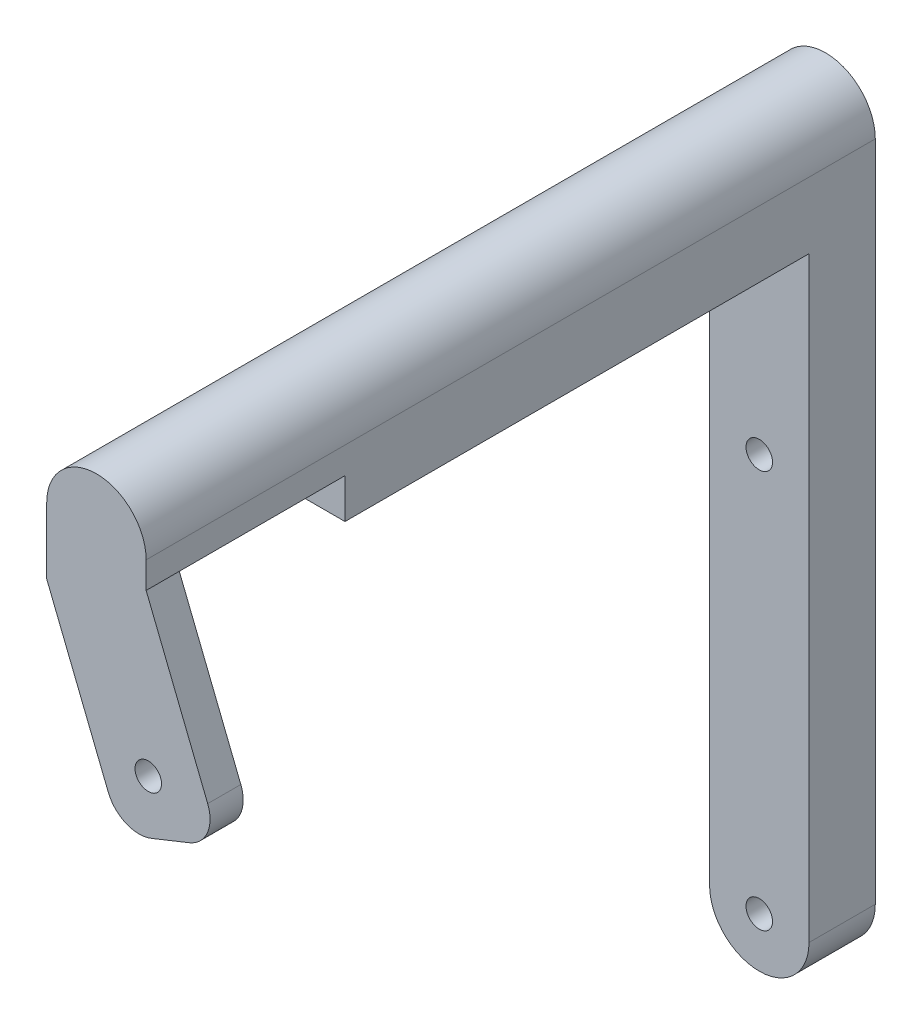
ISO-10303-21;
HEADER;
FILE_DESCRIPTION(('STEP AP214'),'2;1');
FILE_NAME('part.step','',(''),(''),'','','');
FILE_SCHEMA(('AUTOMOTIVE_DESIGN { 1 0 10303 214 1 1 1 1 }'));
ENDSEC;
DATA;
#1=APPLICATION_CONTEXT('core data for automotive mechanical design processes');
#2=APPLICATION_PROTOCOL_DEFINITION('international standard','automotive_design',2000,#1);
#3=PRODUCT_CONTEXT('',#1,'mechanical');
#4=PRODUCT('Part','Part','',(#3));
#5=PRODUCT_RELATED_PRODUCT_CATEGORY('part','',(#4));
#6=PRODUCT_DEFINITION_FORMATION('','',#4);
#7=PRODUCT_DEFINITION_CONTEXT('part definition',#1,'design');
#8=PRODUCT_DEFINITION('design','',#6,#7);
#9=PRODUCT_DEFINITION_SHAPE('','',#8);
#10=(LENGTH_UNIT() NAMED_UNIT(*) SI_UNIT(.MILLI.,.METRE.));
#11=(NAMED_UNIT(*) PLANE_ANGLE_UNIT() SI_UNIT($,.RADIAN.));
#12=(NAMED_UNIT(*) SI_UNIT($,.STERADIAN.) SOLID_ANGLE_UNIT());
#13=UNCERTAINTY_MEASURE_WITH_UNIT(LENGTH_MEASURE(1.E-05),#10,'distance_accuracy_value','');
#14=(GEOMETRIC_REPRESENTATION_CONTEXT(3) GLOBAL_UNCERTAINTY_ASSIGNED_CONTEXT((#13)) GLOBAL_UNIT_ASSIGNED_CONTEXT((#10,
#11,#12)) REPRESENTATION_CONTEXT('',''));
#15=CARTESIAN_POINT('',(0.,0.,0.));
#16=DIRECTION('',(0.,0.,1.));
#17=DIRECTION('',(1.,0.,0.));
#18=AXIS2_PLACEMENT_3D('',#15,#16,#17);
#19=CARTESIAN_POINT('',(-15.,-20.,160.));
#20=DIRECTION('',(-0.371390676354104,0.928476690885259,0.));
#21=DIRECTION('',(-0.928476690885259,-0.371390676354104,0.));
#22=AXIS2_PLACEMENT_3D('',#19,#20,#21);
#23=PLANE('',#22);
#24=DIRECTION('',(0.928476690885259,0.371390676354104,0.));
#25=VECTOR('',#24,1.);
#26=CARTESIAN_POINT('',(-15.,-20.,210.));
#27=LINE('',#26,#25);
#28=CARTESIAN_POINT('',(-15.,-20.,210.));
#29=VERTEX_POINT('',#28);
#30=CARTESIAN_POINT('',(15.,-7.99999999999999,210.));
#31=VERTEX_POINT('',#30);
#32=EDGE_CURVE('E263',#29,#31,#27,.T.);
#33=ORIENTED_EDGE('',*,*,#32,.F.);
#34=DIRECTION('',(0.,0.,-1.));
#35=VECTOR('',#34,1.);
#36=CARTESIAN_POINT('',(-15.,-20.,220.));
#37=LINE('',#36,#35);
#38=CARTESIAN_POINT('',(-15.,-20.,160.));
#39=VERTEX_POINT('',#38);
#40=EDGE_CURVE('E152',#29,#39,#37,.T.);
#41=ORIENTED_EDGE('',*,*,#40,.T.);
#42=DIRECTION('',(-0.928476690885259,-0.371390676354104,0.));
#43=VECTOR('',#42,1.);
#44=CARTESIAN_POINT('',(-15.,-20.,160.));
#45=LINE('',#44,#43);
#46=CARTESIAN_POINT('',(15.,-7.99999999999999,160.));
#47=VERTEX_POINT('',#46);
#48=EDGE_CURVE('E256',#47,#39,#45,.T.);
#49=ORIENTED_EDGE('',*,*,#48,.F.);
#50=DIRECTION('',(0.,0.,1.));
#51=VECTOR('',#50,1.);
#52=CARTESIAN_POINT('',(15.,-7.99999999999999,160.));
#53=LINE('',#52,#51);
#54=EDGE_CURVE('E170',#47,#31,#53,.T.);
#55=ORIENTED_EDGE('',*,*,#54,.T.);
#56=EDGE_LOOP('',(#33,#41,#49,#55));
#57=FACE_BOUND('',#56,.T.);
#58=ADVANCED_FACE('F41',(#57),#23,.F.);
#59=CARTESIAN_POINT('',(0.,0.,20.));
#60=DIRECTION('',(0.,0.,-1.));
#61=DIRECTION('',(-1.,0.,0.));
#62=AXIS2_PLACEMENT_3D('',#59,#60,#61);
#63=CYLINDRICAL_SURFACE('',#62,15.);
#64=CARTESIAN_POINT('',(0.,0.,0.));
#65=DIRECTION('',(0.,0.,1.));
#66=DIRECTION('',(1.,0.,0.));
#67=AXIS2_PLACEMENT_3D('',#64,#65,#66);
#68=CIRCLE('',#67,15.);
#69=CARTESIAN_POINT('',(15.,0.,0.));
#70=VERTEX_POINT('',#69);
#71=CARTESIAN_POINT('',(-15.,0.,0.));
#72=VERTEX_POINT('',#71);
#73=EDGE_CURVE('E192',#70,#72,#68,.T.);
#74=ORIENTED_EDGE('',*,*,#73,.T.);
#75=DIRECTION('',(0.,0.,-1.));
#76=VECTOR('',#75,1.);
#77=CARTESIAN_POINT('',(-15.,0.,20.));
#78=LINE('',#77,#76);
#79=CARTESIAN_POINT('',(-15.,0.,220.));
#80=VERTEX_POINT('',#79);
#81=EDGE_CURVE('E214',#80,#72,#78,.T.);
#82=ORIENTED_EDGE('',*,*,#81,.F.);
#83=CARTESIAN_POINT('',(0.,0.,220.));
#84=DIRECTION('',(0.,0.,1.));
#85=DIRECTION('',(1.,0.,0.));
#86=AXIS2_PLACEMENT_3D('',#83,#84,#85);
#87=CIRCLE('',#86,15.);
#88=CARTESIAN_POINT('',(15.,0.,220.));
#89=VERTEX_POINT('',#88);
#90=EDGE_CURVE('E159',#89,#80,#87,.T.);
#91=ORIENTED_EDGE('',*,*,#90,.F.);
#92=DIRECTION('',(0.,0.,-1.));
#93=VECTOR('',#92,1.);
#94=CARTESIAN_POINT('',(15.,0.,20.));
#95=LINE('',#94,#93);
#96=EDGE_CURVE('E189',#89,#70,#95,.T.);
#97=ORIENTED_EDGE('',*,*,#96,.T.);
#98=EDGE_LOOP('',(#74,#82,#91,#97));
#99=FACE_BOUND('',#98,.T.);
#100=ADVANCED_FACE('F296',(#99),#63,.T.);
#101=CARTESIAN_POINT('',(-15.,0.,20.));
#102=DIRECTION('',(1.,0.,0.));
#103=DIRECTION('',(0.,1.,0.));
#104=AXIS2_PLACEMENT_3D('',#101,#102,#103);
#105=PLANE('',#104);
#106=DIRECTION('',(0.,-1.,0.));
#107=VECTOR('',#106,1.);
#108=CARTESIAN_POINT('',(-15.,0.,0.));
#109=LINE('',#108,#107);
#110=CARTESIAN_POINT('',(-15.,-200.,0.));
#111=VERTEX_POINT('',#110);
#112=EDGE_CURVE('E195',#72,#111,#109,.T.);
#113=ORIENTED_EDGE('',*,*,#112,.T.);
#114=DIRECTION('',(0.,0.,-1.));
#115=VECTOR('',#114,1.);
#116=CARTESIAN_POINT('',(-15.,-200.,20.));
#117=LINE('',#116,#115);
#118=CARTESIAN_POINT('',(-15.,-200.,20.));
#119=VERTEX_POINT('',#118);
#120=EDGE_CURVE('E211',#119,#111,#117,.T.);
#121=ORIENTED_EDGE('',*,*,#120,.F.);
#122=DIRECTION('',(0.,-1.,0.));
#123=VECTOR('',#122,1.);
#124=CARTESIAN_POINT('',(-15.,0.,20.));
#125=LINE('',#124,#123);
#126=CARTESIAN_POINT('',(-15.,-20.,20.));
#127=VERTEX_POINT('',#126);
#128=EDGE_CURVE('E175',#127,#119,#125,.T.);
#129=ORIENTED_EDGE('',*,*,#128,.F.);
#130=EDGE_CURVE('E155',#39,#127,#37,.T.);
#131=ORIENTED_EDGE('',*,*,#130,.F.);
#132=ORIENTED_EDGE('',*,*,#40,.F.);
#133=CARTESIAN_POINT('',(-15.,-20.,220.));
#134=VERTEX_POINT('',#133);
#135=EDGE_CURVE('E136',#134,#29,#37,.T.);
#136=ORIENTED_EDGE('',*,*,#135,.F.);
#137=DIRECTION('',(0.,-1.,0.));
#138=VECTOR('',#137,1.);
#139=CARTESIAN_POINT('',(-15.,0.,220.));
#140=LINE('',#139,#138);
#141=EDGE_CURVE('E149',#80,#134,#140,.T.);
#142=ORIENTED_EDGE('',*,*,#141,.F.);
#143=ORIENTED_EDGE('',*,*,#81,.T.);
#144=EDGE_LOOP('',(#113,#121,#129,#131,#132,#136,#142,#143));
#145=FACE_BOUND('',#144,.T.);
#146=ADVANCED_FACE('F147',(#145),#105,.F.);
#147=CARTESIAN_POINT('',(0.,-200.,20.));
#148=DIRECTION('',(0.,0.,-1.));
#149=DIRECTION('',(-1.,0.,0.));
#150=AXIS2_PLACEMENT_3D('',#147,#148,#149);
#151=CYLINDRICAL_SURFACE('',#150,15.);
#152=CARTESIAN_POINT('',(0.,-200.,0.));
#153=DIRECTION('',(0.,0.,1.));
#154=DIRECTION('',(1.,0.,0.));
#155=AXIS2_PLACEMENT_3D('',#152,#153,#154);
#156=CIRCLE('',#155,15.);
#157=CARTESIAN_POINT('',(15.,-200.,0.));
#158=VERTEX_POINT('',#157);
#159=EDGE_CURVE('E197',#111,#158,#156,.T.);
#160=ORIENTED_EDGE('',*,*,#159,.T.);
#161=DIRECTION('',(0.,0.,-1.));
#162=VECTOR('',#161,1.);
#163=CARTESIAN_POINT('',(15.,-200.,20.));
#164=LINE('',#163,#162);
#165=CARTESIAN_POINT('',(15.,-200.,20.));
#166=VERTEX_POINT('',#165);
#167=EDGE_CURVE('E209',#166,#158,#164,.T.);
#168=ORIENTED_EDGE('',*,*,#167,.F.);
#169=CARTESIAN_POINT('',(0.,-200.,20.));
#170=DIRECTION('',(0.,0.,1.));
#171=DIRECTION('',(1.,0.,0.));
#172=AXIS2_PLACEMENT_3D('',#169,#170,#171);
#173=CIRCLE('',#172,15.);
#174=EDGE_CURVE('E177',#119,#166,#173,.T.);
#175=ORIENTED_EDGE('',*,*,#174,.F.);
#176=ORIENTED_EDGE('',*,*,#120,.T.);
#177=EDGE_LOOP('',(#160,#168,#175,#176));
#178=FACE_BOUND('',#177,.T.);
#179=ADVANCED_FACE('F335',(#178),#151,.T.);
#180=CARTESIAN_POINT('',(0.,-80.,20.));
#181=DIRECTION('',(0.,0.,-1.));
#182=DIRECTION('',(-1.,0.,0.));
#183=AXIS2_PLACEMENT_3D('',#180,#181,#182);
#184=CYLINDRICAL_SURFACE('',#183,4.);
#185=CARTESIAN_POINT('',(0.,-80.,20.));
#186=DIRECTION('',(0.,0.,1.));
#187=DIRECTION('',(1.,0.,0.));
#188=AXIS2_PLACEMENT_3D('',#185,#186,#187);
#189=CIRCLE('',#188,4.);
#190=CARTESIAN_POINT('',(3.99999999999999,-80.,20.));
#191=VERTEX_POINT('',#190);
#192=EDGE_CURVE('E183',#191,#191,#189,.T.);
#193=ORIENTED_EDGE('',*,*,#192,.T.);
#194=EDGE_LOOP('',(#193));
#195=FACE_BOUND('',#194,.T.);
#196=CARTESIAN_POINT('',(0.,-80.,0.));
#197=DIRECTION('',(0.,0.,1.));
#198=DIRECTION('',(1.,0.,0.));
#199=AXIS2_PLACEMENT_3D('',#196,#197,#198);
#200=CIRCLE('',#199,4.);
#201=CARTESIAN_POINT('',(3.99999999999999,-80.,0.));
#202=VERTEX_POINT('',#201);
#203=EDGE_CURVE('E203',#202,#202,#200,.T.);
#204=ORIENTED_EDGE('',*,*,#203,.F.);
#205=EDGE_LOOP('',(#204));
#206=FACE_BOUND('',#205,.T.);
#207=ADVANCED_FACE('F338',(#195,#206),#184,.F.);
#208=CARTESIAN_POINT('',(15.,0.,20.));
#209=DIRECTION('',(1.,0.,0.));
#210=DIRECTION('',(0.,1.,0.));
#211=AXIS2_PLACEMENT_3D('',#208,#209,#210);
#212=PLANE('',#211);
#213=ORIENTED_EDGE('',*,*,#54,.F.);
#214=DIRECTION('',(0.,1.,0.));
#215=VECTOR('',#214,1.);
#216=CARTESIAN_POINT('',(15.,-7.99999999999999,160.));
#217=LINE('',#216,#215);
#218=CARTESIAN_POINT('',(15.,-20.,160.));
#219=VERTEX_POINT('',#218);
#220=EDGE_CURVE('E254',#219,#47,#217,.T.);
#221=ORIENTED_EDGE('',*,*,#220,.F.);
#222=DIRECTION('',(0.,0.,-1.));
#223=VECTOR('',#222,1.);
#224=CARTESIAN_POINT('',(15.,-20.,220.));
#225=LINE('',#224,#223);
#226=CARTESIAN_POINT('',(15.,-20.,20.));
#227=VERTEX_POINT('',#226);
#228=EDGE_CURVE('E162',#219,#227,#225,.T.);
#229=ORIENTED_EDGE('',*,*,#228,.T.);
#230=DIRECTION('',(0.,-1.,0.));
#231=VECTOR('',#230,1.);
#232=CARTESIAN_POINT('',(15.,0.,20.));
#233=LINE('',#232,#231);
#234=EDGE_CURVE('E181',#227,#166,#233,.T.);
#235=ORIENTED_EDGE('',*,*,#234,.T.);
#236=ORIENTED_EDGE('',*,*,#167,.T.);
#237=DIRECTION('',(0.,-1.,0.));
#238=VECTOR('',#237,1.);
#239=CARTESIAN_POINT('',(15.,0.,0.));
#240=LINE('',#239,#238);
#241=EDGE_CURVE('E200',#70,#158,#240,.T.);
#242=ORIENTED_EDGE('',*,*,#241,.F.);
#243=ORIENTED_EDGE('',*,*,#96,.F.);
#244=DIRECTION('',(0.,1.,0.));
#245=VECTOR('',#244,1.);
#246=CARTESIAN_POINT('',(15.,0.,220.));
#247=LINE('',#246,#245);
#248=CARTESIAN_POINT('',(15.,-7.99999999999999,220.));
#249=VERTEX_POINT('',#248);
#250=EDGE_CURVE('E160',#249,#89,#247,.T.);
#251=ORIENTED_EDGE('',*,*,#250,.F.);
#252=DIRECTION('',(0.,0.,1.));
#253=VECTOR('',#252,1.);
#254=CARTESIAN_POINT('',(15.,-7.99999999999999,220.));
#255=LINE('',#254,#253);
#256=EDGE_CURVE('E239',#31,#249,#255,.T.);
#257=ORIENTED_EDGE('',*,*,#256,.F.);
#258=EDGE_LOOP('',(#213,#221,#229,#235,#236,#242,#243,#251,#257));
#259=FACE_BOUND('',#258,.T.);
#260=ADVANCED_FACE('F330',(#259),#212,.T.);
#261=CARTESIAN_POINT('',(0.,0.,20.));
#262=DIRECTION('',(0.,0.,-1.));
#263=DIRECTION('',(-1.,0.,0.));
#264=AXIS2_PLACEMENT_3D('',#261,#262,#263);
#265=CYLINDRICAL_SURFACE('',#264,4.);
#266=CARTESIAN_POINT('',(0.,0.,20.));
#267=DIRECTION('',(0.,0.,1.));
#268=DIRECTION('',(1.,0.,0.));
#269=AXIS2_PLACEMENT_3D('',#266,#267,#268);
#270=CIRCLE('',#269,4.);
#271=CARTESIAN_POINT('',(4.,0.,20.));
#272=VERTEX_POINT('',#271);
#273=EDGE_CURVE('E153',#272,#272,#270,.T.);
#274=ORIENTED_EDGE('',*,*,#273,.T.);
#275=EDGE_LOOP('',(#274));
#276=FACE_BOUND('',#275,.T.);
#277=CARTESIAN_POINT('',(0.,0.,0.));
#278=DIRECTION('',(0.,0.,1.));
#279=DIRECTION('',(1.,0.,0.));
#280=AXIS2_PLACEMENT_3D('',#277,#278,#279);
#281=CIRCLE('',#280,4.);
#282=CARTESIAN_POINT('',(4.,0.,0.));
#283=VERTEX_POINT('',#282);
#284=EDGE_CURVE('E174',#283,#283,#281,.T.);
#285=ORIENTED_EDGE('',*,*,#284,.F.);
#286=EDGE_LOOP('',(#285));
#287=FACE_BOUND('',#286,.T.);
#288=ADVANCED_FACE('F327',(#276,#287),#265,.F.);
#289=CARTESIAN_POINT('',(0.,-200.,20.));
#290=DIRECTION('',(0.,0.,-1.));
#291=DIRECTION('',(-1.,0.,0.));
#292=AXIS2_PLACEMENT_3D('',#289,#290,#291);
#293=CYLINDRICAL_SURFACE('',#292,4.);
#294=CARTESIAN_POINT('',(0.,-200.,20.));
#295=DIRECTION('',(0.,0.,1.));
#296=DIRECTION('',(1.,0.,0.));
#297=AXIS2_PLACEMENT_3D('',#294,#295,#296);
#298=CIRCLE('',#297,4.);
#299=CARTESIAN_POINT('',(4.,-200.,20.));
#300=VERTEX_POINT('',#299);
#301=EDGE_CURVE('E186',#300,#300,#298,.T.);
#302=ORIENTED_EDGE('',*,*,#301,.T.);
#303=EDGE_LOOP('',(#302));
#304=FACE_BOUND('',#303,.T.);
#305=CARTESIAN_POINT('',(0.,-200.,0.));
#306=DIRECTION('',(0.,0.,1.));
#307=DIRECTION('',(1.,0.,0.));
#308=AXIS2_PLACEMENT_3D('',#305,#306,#307);
#309=CIRCLE('',#308,4.);
#310=CARTESIAN_POINT('',(4.,-200.,0.));
#311=VERTEX_POINT('',#310);
#312=EDGE_CURVE('E178',#311,#311,#309,.T.);
#313=ORIENTED_EDGE('',*,*,#312,.F.);
#314=EDGE_LOOP('',(#313));
#315=FACE_BOUND('',#314,.T.);
#316=ADVANCED_FACE('F329',(#304,#315),#293,.F.);
#317=CARTESIAN_POINT('',(0.,0.,20.));
#318=DIRECTION('',(0.,0.,1.));
#319=DIRECTION('',(1.,0.,0.));
#320=AXIS2_PLACEMENT_3D('',#317,#318,#319);
#321=PLANE('',#320);
#322=DIRECTION('',(1.,0.,0.));
#323=VECTOR('',#322,1.);
#324=CARTESIAN_POINT('',(-15.,-20.,20.));
#325=LINE('',#324,#323);
#326=EDGE_CURVE('E164',#127,#227,#325,.T.);
#327=ORIENTED_EDGE('',*,*,#326,.F.);
#328=ORIENTED_EDGE('',*,*,#128,.T.);
#329=ORIENTED_EDGE('',*,*,#174,.T.);
#330=ORIENTED_EDGE('',*,*,#234,.F.);
#331=EDGE_LOOP('',(#327,#328,#329,#330));
#332=FACE_BOUND('',#331,.T.);
#333=ORIENTED_EDGE('',*,*,#192,.F.);
#334=EDGE_LOOP('',(#333));
#335=FACE_BOUND('',#334,.T.);
#336=ORIENTED_EDGE('',*,*,#301,.F.);
#337=EDGE_LOOP('',(#336));
#338=FACE_BOUND('',#337,.T.);
#339=ADVANCED_FACE('F290',(#332,#335,#338),#321,.T.);
#340=CARTESIAN_POINT('',(0.,0.,0.));
#341=DIRECTION('',(0.,0.,1.));
#342=DIRECTION('',(1.,0.,0.));
#343=AXIS2_PLACEMENT_3D('',#340,#341,#342);
#344=PLANE('',#343);
#345=ORIENTED_EDGE('',*,*,#284,.T.);
#346=EDGE_LOOP('',(#345));
#347=FACE_BOUND('',#346,.T.);
#348=ORIENTED_EDGE('',*,*,#73,.F.);
#349=ORIENTED_EDGE('',*,*,#241,.T.);
#350=ORIENTED_EDGE('',*,*,#159,.F.);
#351=ORIENTED_EDGE('',*,*,#112,.F.);
#352=EDGE_LOOP('',(#348,#349,#350,#351));
#353=FACE_BOUND('',#352,.T.);
#354=ORIENTED_EDGE('',*,*,#203,.T.);
#355=EDGE_LOOP('',(#354));
#356=FACE_BOUND('',#355,.T.);
#357=ORIENTED_EDGE('',*,*,#312,.T.);
#358=EDGE_LOOP('',(#357));
#359=FACE_BOUND('',#358,.T.);
#360=ADVANCED_FACE('F281',(#347,#353,#356,#359),#344,.F.);
#361=CARTESIAN_POINT('',(0.,0.,220.));
#362=DIRECTION('',(0.,0.,1.));
#363=DIRECTION('',(1.,0.,0.));
#364=AXIS2_PLACEMENT_3D('',#361,#362,#363);
#365=PLANE('',#364);
#366=CARTESIAN_POINT('',(15.6397307992136,-56.2105909445251,220.));
#367=DIRECTION('',(0.,0.,1.));
#368=DIRECTION('',(1.,0.,0.));
#369=AXIS2_PLACEMENT_3D('',#366,#367,#368);
#370=CIRCLE('',#369,4.00000000000001);
#371=CARTESIAN_POINT('',(19.6397307992136,-56.2105909445251,220.));
#372=VERTEX_POINT('',#371);
#373=EDGE_CURVE('E269',#372,#372,#370,.T.);
#374=ORIENTED_EDGE('',*,*,#373,.F.);
#375=EDGE_LOOP('',(#374));
#376=FACE_BOUND('',#375,.T.);
#377=DIRECTION('',(-0.928476690885259,-0.371390676354104,0.));
#378=VECTOR('',#377,1.);
#379=CARTESIAN_POINT('',(7.28344058124623,-75.7086014531156,220.));
#380=LINE('',#379,#378);
#381=CARTESIAN_POINT('',(27.9986736723936,-67.4225082166566,220.));
#382=VERTEX_POINT('',#381);
#383=CARTESIAN_POINT('',(16.5682074900988,-71.9946946895745,220.));
#384=VERTEX_POINT('',#383);
#385=EDGE_CURVE('E142',#382,#384,#380,.T.);
#386=ORIENTED_EDGE('',*,*,#385,.F.);
#387=CARTESIAN_POINT('',(24.2847669088526,-58.137741307804,220.));
#388=DIRECTION('',(0.,0.,1.));
#389=DIRECTION('',(1.,0.,0.));
#390=AXIS2_PLACEMENT_3D('',#387,#388,#389);
#391=CIRCLE('',#390,10.);
#392=CARTESIAN_POINT('',(33.5695338177052,-54.423834544263,220.));
#393=VERTEX_POINT('',#392);
#394=EDGE_CURVE('E224',#382,#393,#391,.T.);
#395=ORIENTED_EDGE('',*,*,#394,.T.);
#396=DIRECTION('',(-0.371390676354104,0.928476690885259,0.));
#397=VECTOR('',#396,1.);
#398=CARTESIAN_POINT('',(37.2834405812462,-63.7086014531156,220.));
#399=LINE('',#398,#397);
#400=EDGE_CURVE('E141',#393,#249,#399,.T.);
#401=ORIENTED_EDGE('',*,*,#400,.T.);
#402=ORIENTED_EDGE('',*,*,#250,.T.);
#403=ORIENTED_EDGE('',*,*,#90,.T.);
#404=ORIENTED_EDGE('',*,*,#141,.T.);
#405=DIRECTION('',(-0.371390676354104,0.928476690885259,0.));
#406=VECTOR('',#405,1.);
#407=CARTESIAN_POINT('',(7.28344058124623,-75.7086014531156,220.));
#408=LINE('',#407,#406);
#409=CARTESIAN_POINT('',(3.5695338177052,-66.423834544263,220.));
#410=VERTEX_POINT('',#409);
#411=EDGE_CURVE('E133',#410,#134,#408,.T.);
#412=ORIENTED_EDGE('',*,*,#411,.F.);
#413=CARTESIAN_POINT('',(12.8543007265578,-62.7099277807219,220.));
#414=DIRECTION('',(0.,0.,1.));
#415=DIRECTION('',(1.,0.,0.));
#416=AXIS2_PLACEMENT_3D('',#413,#414,#415);
#417=CIRCLE('',#416,10.);
#418=EDGE_CURVE('E222',#410,#384,#417,.T.);
#419=ORIENTED_EDGE('',*,*,#418,.T.);
#420=EDGE_LOOP('',(#386,#395,#401,#402,#403,#404,#412,#419));
#421=FACE_BOUND('',#420,.T.);
#422=ADVANCED_FACE('F157',(#376,#421),#365,.T.);
#423=CARTESIAN_POINT('',(-15.,-20.,220.));
#424=DIRECTION('',(0.,1.,0.));
#425=DIRECTION('',(0.,0.,1.));
#426=AXIS2_PLACEMENT_3D('',#423,#424,#425);
#427=PLANE('',#426);
#428=ORIENTED_EDGE('',*,*,#228,.F.);
#429=DIRECTION('',(1.,0.,0.));
#430=VECTOR('',#429,1.);
#431=CARTESIAN_POINT('',(-15.,-20.,160.));
#432=LINE('',#431,#430);
#433=EDGE_CURVE('E252',#39,#219,#432,.T.);
#434=ORIENTED_EDGE('',*,*,#433,.F.);
#435=ORIENTED_EDGE('',*,*,#130,.T.);
#436=ORIENTED_EDGE('',*,*,#326,.T.);
#437=EDGE_LOOP('',(#428,#434,#435,#436));
#438=FACE_BOUND('',#437,.T.);
#439=ADVANCED_FACE('F280',(#438),#427,.F.);
#440=CARTESIAN_POINT('',(0.,0.,20.));
#441=DIRECTION('',(0.,0.,1.));
#442=DIRECTION('',(1.,0.,0.));
#443=AXIS2_PLACEMENT_3D('',#440,#441,#442);
#444=PLANE('',#443);
#445=ORIENTED_EDGE('',*,*,#273,.F.);
#446=EDGE_LOOP('',(#445));
#447=FACE_BOUND('',#446,.T.);
#448=ADVANCED_FACE('F287',(#447),#444,.F.);
#449=CARTESIAN_POINT('',(0.,0.,160.));
#450=DIRECTION('',(0.,0.,-1.));
#451=DIRECTION('',(-1.,0.,0.));
#452=AXIS2_PLACEMENT_3D('',#449,#450,#451);
#453=PLANE('',#452);
#454=ORIENTED_EDGE('',*,*,#433,.T.);
#455=ORIENTED_EDGE('',*,*,#220,.T.);
#456=ORIENTED_EDGE('',*,*,#48,.T.);
#457=EDGE_LOOP('',(#454,#455,#456));
#458=FACE_BOUND('',#457,.T.);
#459=ADVANCED_FACE('F303',(#458),#453,.F.);
#460=CARTESIAN_POINT('',(7.28344058124623,-75.7086014531156,220.));
#461=DIRECTION('',(0.928476690885259,0.371390676354104,0.));
#462=DIRECTION('',(-0.371390676354104,0.928476690885259,0.));
#463=AXIS2_PLACEMENT_3D('',#460,#461,#462);
#464=PLANE('',#463);
#465=DIRECTION('',(-0.371390676354104,0.928476690885259,0.));
#466=VECTOR('',#465,1.);
#467=CARTESIAN_POINT('',(7.28344058124623,-75.7086014531156,210.));
#468=LINE('',#467,#466);
#469=CARTESIAN_POINT('',(3.5695338177052,-66.423834544263,210.));
#470=VERTEX_POINT('',#469);
#471=EDGE_CURVE('E247',#470,#29,#468,.T.);
#472=ORIENTED_EDGE('',*,*,#471,.F.);
#473=DIRECTION('',(0.,0.,-1.));
#474=VECTOR('',#473,1.);
#475=CARTESIAN_POINT('',(3.5695338177052,-66.423834544263,220.));
#476=LINE('',#475,#474);
#477=EDGE_CURVE('E11',#470,#410,#476,.F.);
#478=ORIENTED_EDGE('',*,*,#477,.T.);
#479=ORIENTED_EDGE('',*,*,#411,.T.);
#480=ORIENTED_EDGE('',*,*,#135,.T.);
#481=EDGE_LOOP('',(#472,#478,#479,#480));
#482=FACE_BOUND('',#481,.T.);
#483=ADVANCED_FACE('F135',(#482),#464,.F.);
#484=CARTESIAN_POINT('',(7.28344058124623,-75.7086014531156,210.));
#485=DIRECTION('',(0.,0.,1.));
#486=DIRECTION('',(1.,0.,0.));
#487=AXIS2_PLACEMENT_3D('',#484,#485,#486);
#488=PLANE('',#487);
#489=CARTESIAN_POINT('',(15.6397307992136,-56.2105909445251,210.));
#490=DIRECTION('',(0.,0.,1.));
#491=DIRECTION('',(1.,0.,0.));
#492=AXIS2_PLACEMENT_3D('',#489,#490,#491);
#493=CIRCLE('',#492,4.00000000000001);
#494=CARTESIAN_POINT('',(19.6397307992136,-56.2105909445251,210.));
#495=VERTEX_POINT('',#494);
#496=EDGE_CURVE('E266',#495,#495,#493,.F.);
#497=ORIENTED_EDGE('',*,*,#496,.F.);
#498=EDGE_LOOP('',(#497));
#499=FACE_BOUND('',#498,.T.);
#500=DIRECTION('',(-0.371390676354104,0.928476690885259,0.));
#501=VECTOR('',#500,1.);
#502=CARTESIAN_POINT('',(37.2834405812462,-63.7086014531156,210.));
#503=LINE('',#502,#501);
#504=CARTESIAN_POINT('',(33.5695338177052,-54.423834544263,210.));
#505=VERTEX_POINT('',#504);
#506=EDGE_CURVE('E232',#505,#31,#503,.T.);
#507=ORIENTED_EDGE('',*,*,#506,.F.);
#508=CARTESIAN_POINT('',(24.2847669088526,-58.137741307804,210.));
#509=DIRECTION('',(0.,0.,1.));
#510=DIRECTION('',(1.,0.,0.));
#511=AXIS2_PLACEMENT_3D('',#508,#509,#510);
#512=CIRCLE('',#511,10.);
#513=CARTESIAN_POINT('',(27.9986736723936,-67.4225082166566,210.));
#514=VERTEX_POINT('',#513);
#515=EDGE_CURVE('E49',#505,#514,#512,.F.);
#516=ORIENTED_EDGE('',*,*,#515,.T.);
#517=DIRECTION('',(0.928476690885259,0.371390676354104,0.));
#518=VECTOR('',#517,1.);
#519=CARTESIAN_POINT('',(7.28344058124623,-75.7086014531156,210.));
#520=LINE('',#519,#518);
#521=CARTESIAN_POINT('',(16.5682074900988,-71.9946946895745,210.));
#522=VERTEX_POINT('',#521);
#523=EDGE_CURVE('E230',#522,#514,#520,.T.);
#524=ORIENTED_EDGE('',*,*,#523,.F.);
#525=CARTESIAN_POINT('',(12.8543007265578,-62.7099277807219,210.));
#526=DIRECTION('',(0.,0.,1.));
#527=DIRECTION('',(1.,0.,0.));
#528=AXIS2_PLACEMENT_3D('',#525,#526,#527);
#529=CIRCLE('',#528,10.);
#530=EDGE_CURVE('E56',#522,#470,#529,.F.);
#531=ORIENTED_EDGE('',*,*,#530,.T.);
#532=ORIENTED_EDGE('',*,*,#471,.T.);
#533=ORIENTED_EDGE('',*,*,#32,.T.);
#534=EDGE_LOOP('',(#507,#516,#524,#531,#532,#533));
#535=FACE_BOUND('',#534,.T.);
#536=ADVANCED_FACE('F229',(#499,#535),#488,.F.);
#537=CARTESIAN_POINT('',(37.2834405812462,-63.7086014531156,220.));
#538=DIRECTION('',(-0.928476690885259,-0.371390676354104,0.));
#539=DIRECTION('',(0.371390676354104,-0.928476690885259,0.));
#540=AXIS2_PLACEMENT_3D('',#537,#538,#539);
#541=PLANE('',#540);
#542=ORIENTED_EDGE('',*,*,#400,.F.);
#543=DIRECTION('',(0.,0.,1.));
#544=VECTOR('',#543,1.);
#545=CARTESIAN_POINT('',(33.5695338177052,-54.423834544263,210.));
#546=LINE('',#545,#544);
#547=EDGE_CURVE('E64',#393,#505,#546,.F.);
#548=ORIENTED_EDGE('',*,*,#547,.T.);
#549=ORIENTED_EDGE('',*,*,#506,.T.);
#550=ORIENTED_EDGE('',*,*,#256,.T.);
#551=EDGE_LOOP('',(#542,#548,#549,#550));
#552=FACE_BOUND('',#551,.T.);
#553=ADVANCED_FACE('F244',(#552),#541,.F.);
#554=CARTESIAN_POINT('',(27.1110267881428,-67.7775669703569,0.));
#555=DIRECTION('',(0.371390676354104,-0.928476690885259,0.));
#556=DIRECTION('',(0.928476690885259,0.371390676354104,0.));
#557=AXIS2_PLACEMENT_3D('',#554,#555,#556);
#558=PLANE('',#557);
#559=ORIENTED_EDGE('',*,*,#523,.T.);
#560=DIRECTION('',(0.,0.,1.));
#561=VECTOR('',#560,1.);
#562=CARTESIAN_POINT('',(27.9986736723936,-67.4225082166566,220.));
#563=LINE('',#562,#561);
#564=EDGE_CURVE('E219',#514,#382,#563,.T.);
#565=ORIENTED_EDGE('',*,*,#564,.T.);
#566=ORIENTED_EDGE('',*,*,#385,.T.);
#567=DIRECTION('',(0.,0.,-1.));
#568=VECTOR('',#567,1.);
#569=CARTESIAN_POINT('',(16.5682074900988,-71.9946946895745,210.));
#570=LINE('',#569,#568);
#571=EDGE_CURVE('E216',#384,#522,#570,.T.);
#572=ORIENTED_EDGE('',*,*,#571,.T.);
#573=EDGE_LOOP('',(#559,#565,#566,#572));
#574=FACE_BOUND('',#573,.T.);
#575=ADVANCED_FACE('F236',(#574),#558,.T.);
#576=CARTESIAN_POINT('',(24.2847669088526,-58.137741307804,0.));
#577=DIRECTION('',(0.,0.,-1.));
#578=DIRECTION('',(-1.,0.,0.));
#579=AXIS2_PLACEMENT_3D('',#576,#577,#578);
#580=CYLINDRICAL_SURFACE('',#579,10.);
#581=ORIENTED_EDGE('',*,*,#515,.F.);
#582=ORIENTED_EDGE('',*,*,#547,.F.);
#583=ORIENTED_EDGE('',*,*,#394,.F.);
#584=ORIENTED_EDGE('',*,*,#564,.F.);
#585=EDGE_LOOP('',(#581,#582,#583,#584));
#586=FACE_BOUND('',#585,.T.);
#587=ADVANCED_FACE('F241',(#586),#580,.T.);
#588=CARTESIAN_POINT('',(12.8543007265578,-62.7099277807219,0.));
#589=DIRECTION('',(0.,0.,1.));
#590=DIRECTION('',(1.,0.,0.));
#591=AXIS2_PLACEMENT_3D('',#588,#589,#590);
#592=CYLINDRICAL_SURFACE('',#591,10.);
#593=ORIENTED_EDGE('',*,*,#418,.F.);
#594=ORIENTED_EDGE('',*,*,#477,.F.);
#595=ORIENTED_EDGE('',*,*,#530,.F.);
#596=ORIENTED_EDGE('',*,*,#571,.F.);
#597=EDGE_LOOP('',(#593,#594,#595,#596));
#598=FACE_BOUND('',#597,.T.);
#599=ADVANCED_FACE('F43',(#598),#592,.T.);
#600=CARTESIAN_POINT('',(15.6397307992136,-56.2105909445251,-0.001000000000001));
#601=DIRECTION('',(0.,0.,1.));
#602=DIRECTION('',(1.,0.,0.));
#603=AXIS2_PLACEMENT_3D('',#600,#601,#602);
#604=CYLINDRICAL_SURFACE('',#603,4.00000000000001);
#605=ORIENTED_EDGE('',*,*,#373,.T.);
#606=EDGE_LOOP('',(#605));
#607=FACE_BOUND('',#606,.T.);
#608=ORIENTED_EDGE('',*,*,#496,.T.);
#609=EDGE_LOOP('',(#608));
#610=FACE_BOUND('',#609,.T.);
#611=ADVANCED_FACE('F276',(#607,#610),#604,.F.);
#612=CLOSED_SHELL('',(#58,#100,#146,#179,#207,#260,#288,#316,#339,#360,#422,#439,#448,#459,#483,
#536,#553,#575,#587,#599,#611));
#613=MANIFOLD_SOLID_BREP('B2',#612);
#614=ADVANCED_BREP_SHAPE_REPRESENTATION('',(#18,#613),#14);
#615=SHAPE_DEFINITION_REPRESENTATION(#9,#614);
ENDSEC;
END-ISO-10303-21;
